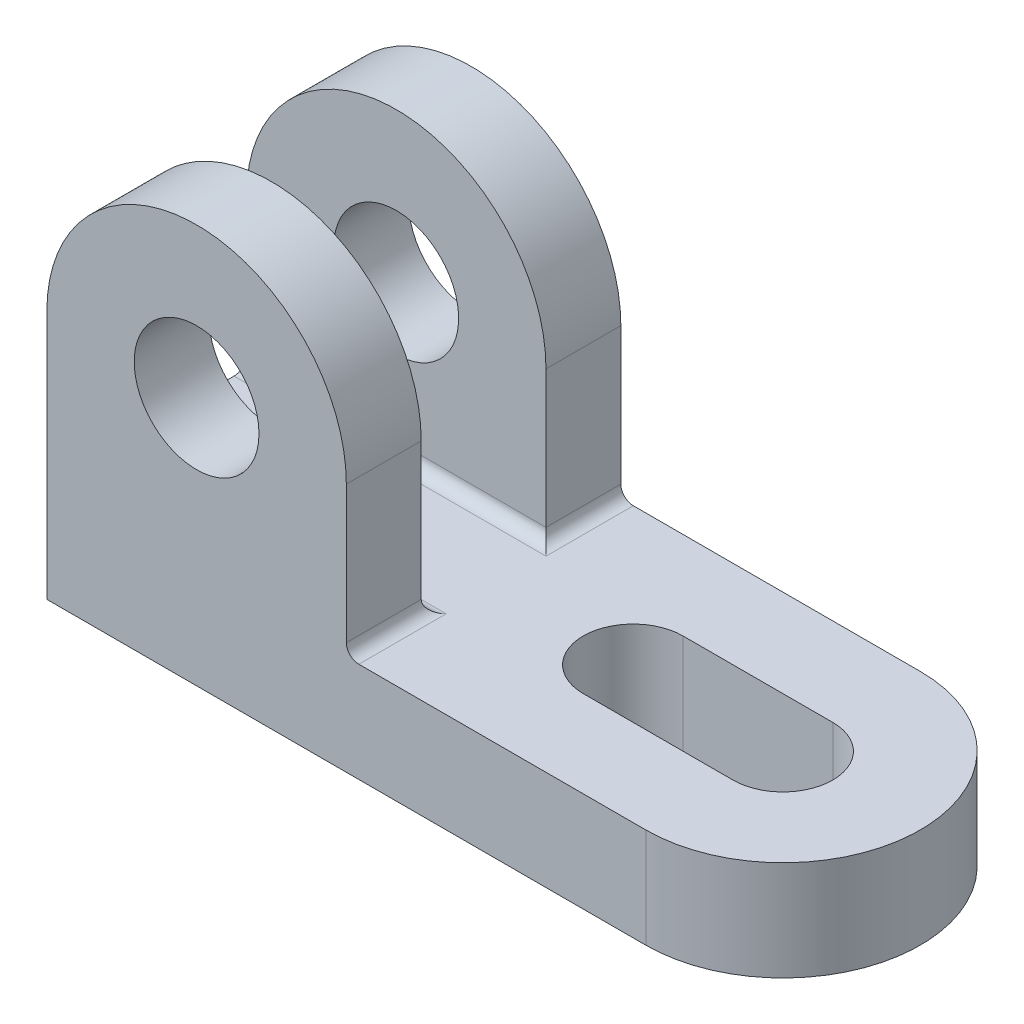
ISO-10303-21;
HEADER;
FILE_DESCRIPTION(('STEP AP214'),'2;1');
FILE_NAME('part.step','',(''),(''),'','','');
FILE_SCHEMA(('AUTOMOTIVE_DESIGN { 1 0 10303 214 1 1 1 1 }'));
ENDSEC;
DATA;
#1=APPLICATION_CONTEXT('core data for automotive mechanical design processes');
#2=APPLICATION_PROTOCOL_DEFINITION('international standard','automotive_design',2000,#1);
#3=PRODUCT_CONTEXT('',#1,'mechanical');
#4=PRODUCT('Part','Part','',(#3));
#5=PRODUCT_RELATED_PRODUCT_CATEGORY('part','',(#4));
#6=PRODUCT_DEFINITION_FORMATION('','',#4);
#7=PRODUCT_DEFINITION_CONTEXT('part definition',#1,'design');
#8=PRODUCT_DEFINITION('design','',#6,#7);
#9=PRODUCT_DEFINITION_SHAPE('','',#8);
#10=(LENGTH_UNIT() NAMED_UNIT(*) SI_UNIT(.MILLI.,.METRE.));
#11=(NAMED_UNIT(*) PLANE_ANGLE_UNIT() SI_UNIT($,.RADIAN.));
#12=(NAMED_UNIT(*) SI_UNIT($,.STERADIAN.) SOLID_ANGLE_UNIT());
#13=UNCERTAINTY_MEASURE_WITH_UNIT(LENGTH_MEASURE(1.E-05),#10,'distance_accuracy_value','');
#14=(GEOMETRIC_REPRESENTATION_CONTEXT(3) GLOBAL_UNCERTAINTY_ASSIGNED_CONTEXT((#13)) GLOBAL_UNIT_ASSIGNED_CONTEXT((#10,
#11,#12)) REPRESENTATION_CONTEXT('',''));
#15=CARTESIAN_POINT('',(0.,0.,0.));
#16=DIRECTION('',(0.,0.,1.));
#17=DIRECTION('',(1.,0.,0.));
#18=AXIS2_PLACEMENT_3D('',#15,#16,#17);
#19=CARTESIAN_POINT('',(0.,16.,0.));
#20=DIRECTION('',(1.,0.,0.));
#21=DIRECTION('',(0.,0.,-1.));
#22=AXIS2_PLACEMENT_3D('',#19,#20,#21);
#23=PLANE('',#22);
#24=DIRECTION('',(0.,0.,1.));
#25=VECTOR('',#24,1.);
#26=CARTESIAN_POINT('',(0.,0.,0.));
#27=LINE('',#26,#25);
#28=CARTESIAN_POINT('',(0.,0.,-44.));
#29=VERTEX_POINT('',#28);
#30=CARTESIAN_POINT('',(0.,0.,0.));
#31=VERTEX_POINT('',#30);
#32=EDGE_CURVE('E252',#29,#31,#27,.T.);
#33=ORIENTED_EDGE('',*,*,#32,.T.);
#34=DIRECTION('',(0.,-1.,0.));
#35=VECTOR('',#34,1.);
#36=CARTESIAN_POINT('',(0.,16.,0.));
#37=LINE('',#36,#35);
#38=CARTESIAN_POINT('',(0.,40.,0.));
#39=VERTEX_POINT('',#38);
#40=EDGE_CURVE('E279',#39,#31,#37,.T.);
#41=ORIENTED_EDGE('',*,*,#40,.F.);
#42=DIRECTION('',(0.,0.,1.));
#43=VECTOR('',#42,1.);
#44=CARTESIAN_POINT('',(0.,40.,-12.));
#45=LINE('',#44,#43);
#46=CARTESIAN_POINT('',(0.,40.,-12.));
#47=VERTEX_POINT('',#46);
#48=EDGE_CURVE('E211',#47,#39,#45,.T.);
#49=ORIENTED_EDGE('',*,*,#48,.F.);
#50=DIRECTION('',(0.,1.,0.));
#51=VECTOR('',#50,1.);
#52=CARTESIAN_POINT('',(0.,0.,-12.));
#53=LINE('',#52,#51);
#54=CARTESIAN_POINT('',(0.,18.,-12.));
#55=VERTEX_POINT('',#54);
#56=EDGE_CURVE('E210',#55,#47,#53,.T.);
#57=ORIENTED_EDGE('',*,*,#56,.F.);
#58=CARTESIAN_POINT('',(0.,18.,-14.));
#59=DIRECTION('',(1.,0.,0.));
#60=DIRECTION('',(0.,0.,-1.));
#61=AXIS2_PLACEMENT_3D('',#58,#59,#60);
#62=CIRCLE('',#61,2.);
#63=CARTESIAN_POINT('',(0.,16.,-14.));
#64=VERTEX_POINT('',#63);
#65=EDGE_CURVE('E11',#55,#64,#62,.T.);
#66=ORIENTED_EDGE('',*,*,#65,.T.);
#67=DIRECTION('',(0.,0.,1.));
#68=VECTOR('',#67,1.);
#69=CARTESIAN_POINT('',(0.,16.,0.));
#70=LINE('',#69,#68);
#71=CARTESIAN_POINT('',(0.,16.,-30.));
#72=VERTEX_POINT('',#71);
#73=EDGE_CURVE('E251',#72,#64,#70,.T.);
#74=ORIENTED_EDGE('',*,*,#73,.F.);
#75=CARTESIAN_POINT('',(0.,18.,-30.));
#76=DIRECTION('',(1.,0.,0.));
#77=DIRECTION('',(0.,0.,-1.));
#78=AXIS2_PLACEMENT_3D('',#75,#76,#77);
#79=CIRCLE('',#78,2.);
#80=CARTESIAN_POINT('',(0.,18.,-32.));
#81=VERTEX_POINT('',#80);
#82=EDGE_CURVE('E172',#72,#81,#79,.T.);
#83=ORIENTED_EDGE('',*,*,#82,.T.);
#84=DIRECTION('',(0.,1.,0.));
#85=VECTOR('',#84,1.);
#86=CARTESIAN_POINT('',(0.,16.,-32.));
#87=LINE('',#86,#85);
#88=CARTESIAN_POINT('',(0.,40.,-32.));
#89=VERTEX_POINT('',#88);
#90=EDGE_CURVE('E163',#81,#89,#87,.T.);
#91=ORIENTED_EDGE('',*,*,#90,.T.);
#92=DIRECTION('',(0.,0.,-1.));
#93=VECTOR('',#92,1.);
#94=CARTESIAN_POINT('',(0.,40.,-32.));
#95=LINE('',#94,#93);
#96=CARTESIAN_POINT('',(0.,40.,-44.));
#97=VERTEX_POINT('',#96);
#98=EDGE_CURVE('E169',#89,#97,#95,.T.);
#99=ORIENTED_EDGE('',*,*,#98,.T.);
#100=DIRECTION('',(0.,-1.,0.));
#101=VECTOR('',#100,1.);
#102=CARTESIAN_POINT('',(0.,16.,-44.));
#103=LINE('',#102,#101);
#104=EDGE_CURVE('E262',#97,#29,#103,.T.);
#105=ORIENTED_EDGE('',*,*,#104,.T.);
#106=EDGE_LOOP('',(#33,#41,#49,#57,#66,#74,#83,#91,#99,#105));
#107=FACE_BOUND('',#106,.T.);
#108=ADVANCED_FACE('F43',(#107),#23,.F.);
#109=CARTESIAN_POINT('',(0.,16.,0.));
#110=DIRECTION('',(0.,0.,-1.));
#111=DIRECTION('',(-1.,0.,0.));
#112=AXIS2_PLACEMENT_3D('',#109,#110,#111);
#113=PLANE('',#112);
#114=DIRECTION('',(1.,0.,0.));
#115=VECTOR('',#114,1.);
#116=CARTESIAN_POINT('',(0.,0.,0.));
#117=LINE('',#116,#115);
#118=CARTESIAN_POINT('',(96.,0.,0.));
#119=VERTEX_POINT('',#118);
#120=EDGE_CURVE('E266',#31,#119,#117,.T.);
#121=ORIENTED_EDGE('',*,*,#120,.T.);
#122=DIRECTION('',(0.,-1.,0.));
#123=VECTOR('',#122,1.);
#124=CARTESIAN_POINT('',(96.,16.,0.));
#125=LINE('',#124,#123);
#126=CARTESIAN_POINT('',(96.,16.,0.));
#127=VERTEX_POINT('',#126);
#128=EDGE_CURVE('E274',#127,#119,#125,.T.);
#129=ORIENTED_EDGE('',*,*,#128,.F.);
#130=DIRECTION('',(1.,0.,0.));
#131=VECTOR('',#130,1.);
#132=CARTESIAN_POINT('',(0.,16.,0.));
#133=LINE('',#132,#131);
#134=CARTESIAN_POINT('',(50.,16.,0.));
#135=VERTEX_POINT('',#134);
#136=EDGE_CURVE('E258',#135,#127,#133,.T.);
#137=ORIENTED_EDGE('',*,*,#136,.F.);
#138=CARTESIAN_POINT('',(50.,18.,0.));
#139=DIRECTION('',(0.,0.,-1.));
#140=DIRECTION('',(-1.,0.,0.));
#141=AXIS2_PLACEMENT_3D('',#138,#139,#140);
#142=CIRCLE('',#141,2.);
#143=CARTESIAN_POINT('',(48.,18.,0.));
#144=VERTEX_POINT('',#143);
#145=EDGE_CURVE('E55',#135,#144,#142,.T.);
#146=ORIENTED_EDGE('',*,*,#145,.T.);
#147=DIRECTION('',(0.,1.,0.));
#148=VECTOR('',#147,1.);
#149=CARTESIAN_POINT('',(48.,0.,0.));
#150=LINE('',#149,#148);
#151=CARTESIAN_POINT('',(48.,40.,0.));
#152=VERTEX_POINT('',#151);
#153=EDGE_CURVE('E204',#144,#152,#150,.T.);
#154=ORIENTED_EDGE('',*,*,#153,.T.);
#155=CARTESIAN_POINT('',(24.,40.,0.));
#156=DIRECTION('',(0.,0.,1.));
#157=DIRECTION('',(1.,0.,0.));
#158=AXIS2_PLACEMENT_3D('',#155,#156,#157);
#159=CIRCLE('',#158,24.);
#160=EDGE_CURVE('E212',#152,#39,#159,.T.);
#161=ORIENTED_EDGE('',*,*,#160,.T.);
#162=ORIENTED_EDGE('',*,*,#40,.T.);
#163=EDGE_LOOP('',(#121,#129,#137,#146,#154,#161,#162));
#164=FACE_BOUND('',#163,.T.);
#165=CARTESIAN_POINT('',(24.,40.,0.));
#166=DIRECTION('',(0.,0.,1.));
#167=DIRECTION('',(1.,0.,0.));
#168=AXIS2_PLACEMENT_3D('',#165,#166,#167);
#169=CIRCLE('',#168,10.);
#170=CARTESIAN_POINT('',(34.,40.,0.));
#171=VERTEX_POINT('',#170);
#172=EDGE_CURVE('E196',#171,#171,#169,.T.);
#173=ORIENTED_EDGE('',*,*,#172,.F.);
#174=EDGE_LOOP('',(#173));
#175=FACE_BOUND('',#174,.T.);
#176=ADVANCED_FACE('F336',(#164,#175),#113,.F.);
#177=CARTESIAN_POINT('',(96.,16.,-22.));
#178=DIRECTION('',(0.,-1.,0.));
#179=DIRECTION('',(0.,0.,-1.));
#180=AXIS2_PLACEMENT_3D('',#177,#178,#179);
#181=CYLINDRICAL_SURFACE('',#180,22.);
#182=CARTESIAN_POINT('',(96.,0.,-22.));
#183=DIRECTION('',(0.,1.,0.));
#184=DIRECTION('',(0.,0.,1.));
#185=AXIS2_PLACEMENT_3D('',#182,#183,#184);
#186=CIRCLE('',#185,22.);
#187=CARTESIAN_POINT('',(96.,0.,-44.));
#188=VERTEX_POINT('',#187);
#189=EDGE_CURVE('E268',#119,#188,#186,.T.);
#190=ORIENTED_EDGE('',*,*,#189,.T.);
#191=DIRECTION('',(0.,-1.,0.));
#192=VECTOR('',#191,1.);
#193=CARTESIAN_POINT('',(96.,16.,-44.));
#194=LINE('',#193,#192);
#195=CARTESIAN_POINT('',(96.,16.,-44.));
#196=VERTEX_POINT('',#195);
#197=EDGE_CURVE('E275',#196,#188,#194,.T.);
#198=ORIENTED_EDGE('',*,*,#197,.F.);
#199=CARTESIAN_POINT('',(96.,16.,-22.));
#200=DIRECTION('',(0.,1.,0.));
#201=DIRECTION('',(0.,0.,1.));
#202=AXIS2_PLACEMENT_3D('',#199,#200,#201);
#203=CIRCLE('',#202,22.);
#204=EDGE_CURVE('E259',#127,#196,#203,.T.);
#205=ORIENTED_EDGE('',*,*,#204,.F.);
#206=ORIENTED_EDGE('',*,*,#128,.T.);
#207=EDGE_LOOP('',(#190,#198,#205,#206));
#208=FACE_BOUND('',#207,.T.);
#209=ADVANCED_FACE('F349',(#208),#181,.T.);
#210=CARTESIAN_POINT('',(0.,16.,-44.));
#211=DIRECTION('',(0.,0.,1.));
#212=DIRECTION('',(1.,0.,0.));
#213=AXIS2_PLACEMENT_3D('',#210,#211,#212);
#214=PLANE('',#213);
#215=DIRECTION('',(-1.,0.,0.));
#216=VECTOR('',#215,1.);
#217=CARTESIAN_POINT('',(0.,0.,-44.));
#218=LINE('',#217,#216);
#219=EDGE_CURVE('E260',#188,#29,#218,.T.);
#220=ORIENTED_EDGE('',*,*,#219,.T.);
#221=ORIENTED_EDGE('',*,*,#104,.F.);
#222=CARTESIAN_POINT('',(24.,40.,-44.));
#223=DIRECTION('',(0.,0.,-1.));
#224=DIRECTION('',(-1.,0.,0.));
#225=AXIS2_PLACEMENT_3D('',#222,#223,#224);
#226=CIRCLE('',#225,24.);
#227=CARTESIAN_POINT('',(48.,40.,-44.));
#228=VERTEX_POINT('',#227);
#229=EDGE_CURVE('E181',#97,#228,#226,.T.);
#230=ORIENTED_EDGE('',*,*,#229,.T.);
#231=DIRECTION('',(0.,-1.,0.));
#232=VECTOR('',#231,1.);
#233=CARTESIAN_POINT('',(48.,16.,-44.));
#234=LINE('',#233,#232);
#235=CARTESIAN_POINT('',(48.,18.,-44.));
#236=VERTEX_POINT('',#235);
#237=EDGE_CURVE('E176',#228,#236,#234,.T.);
#238=ORIENTED_EDGE('',*,*,#237,.T.);
#239=CARTESIAN_POINT('',(50.,18.,-44.));
#240=DIRECTION('',(0.,0.,1.));
#241=DIRECTION('',(1.,0.,0.));
#242=AXIS2_PLACEMENT_3D('',#239,#240,#241);
#243=CIRCLE('',#242,2.);
#244=CARTESIAN_POINT('',(50.,16.,-44.));
#245=VERTEX_POINT('',#244);
#246=EDGE_CURVE('E297',#236,#245,#243,.T.);
#247=ORIENTED_EDGE('',*,*,#246,.T.);
#248=DIRECTION('',(-1.,0.,0.));
#249=VECTOR('',#248,1.);
#250=CARTESIAN_POINT('',(0.,16.,-44.));
#251=LINE('',#250,#249);
#252=EDGE_CURVE('E261',#196,#245,#251,.T.);
#253=ORIENTED_EDGE('',*,*,#252,.F.);
#254=ORIENTED_EDGE('',*,*,#197,.T.);
#255=EDGE_LOOP('',(#220,#221,#230,#238,#247,#253,#254));
#256=FACE_BOUND('',#255,.T.);
#257=CARTESIAN_POINT('',(24.,40.,-44.));
#258=DIRECTION('',(0.,0.,-1.));
#259=DIRECTION('',(-1.,0.,0.));
#260=AXIS2_PLACEMENT_3D('',#257,#258,#259);
#261=CIRCLE('',#260,10.);
#262=CARTESIAN_POINT('',(14.,40.,-44.));
#263=VERTEX_POINT('',#262);
#264=EDGE_CURVE('E301',#263,#263,#261,.T.);
#265=ORIENTED_EDGE('',*,*,#264,.F.);
#266=EDGE_LOOP('',(#265));
#267=FACE_BOUND('',#266,.T.);
#268=ADVANCED_FACE('F330',(#256,#267),#214,.F.);
#269=CARTESIAN_POINT('',(96.,16.,-22.));
#270=DIRECTION('',(0.,1.,0.));
#271=DIRECTION('',(0.,0.,1.));
#272=AXIS2_PLACEMENT_3D('',#269,#270,#271);
#273=PLANE('',#272);
#274=ORIENTED_EDGE('',*,*,#252,.T.);
#275=DIRECTION('',(0.,0.,-1.));
#276=VECTOR('',#275,1.);
#277=CARTESIAN_POINT('',(50.,16.,-32.));
#278=LINE('',#277,#276);
#279=CARTESIAN_POINT('',(50.,16.,-30.));
#280=VERTEX_POINT('',#279);
#281=EDGE_CURVE('E292',#245,#280,#278,.F.);
#282=ORIENTED_EDGE('',*,*,#281,.T.);
#283=DIRECTION('',(-1.,0.,0.));
#284=VECTOR('',#283,1.);
#285=CARTESIAN_POINT('',(96.,16.,-30.));
#286=LINE('',#285,#284);
#287=EDGE_CURVE('E288',#280,#72,#286,.T.);
#288=ORIENTED_EDGE('',*,*,#287,.T.);
#289=ORIENTED_EDGE('',*,*,#73,.T.);
#290=DIRECTION('',(-1.,0.,0.));
#291=VECTOR('',#290,1.);
#292=CARTESIAN_POINT('',(96.,16.,-14.));
#293=LINE('',#292,#291);
#294=CARTESIAN_POINT('',(50.,16.,-14.));
#295=VERTEX_POINT('',#294);
#296=EDGE_CURVE('E283',#64,#295,#293,.F.);
#297=ORIENTED_EDGE('',*,*,#296,.T.);
#298=DIRECTION('',(0.,0.,1.));
#299=VECTOR('',#298,1.);
#300=CARTESIAN_POINT('',(50.,16.,0.));
#301=LINE('',#300,#299);
#302=EDGE_CURVE('E289',#295,#135,#301,.T.);
#303=ORIENTED_EDGE('',*,*,#302,.T.);
#304=ORIENTED_EDGE('',*,*,#136,.T.);
#305=ORIENTED_EDGE('',*,*,#204,.T.);
#306=EDGE_LOOP('',(#274,#282,#288,#289,#297,#303,#304,#305));
#307=FACE_BOUND('',#306,.T.);
#308=CARTESIAN_POINT('',(96.0557415435694,16.,-21.9095880470179));
#309=DIRECTION('',(0.,1.,0.));
#310=DIRECTION('',(0.,0.,1.));
#311=AXIS2_PLACEMENT_3D('',#308,#309,#310);
#312=CIRCLE('',#311,8.);
#313=CARTESIAN_POINT('',(96.0557415435694,16.,-13.9095880470179));
#314=VERTEX_POINT('',#313);
#315=CARTESIAN_POINT('',(96.0557415435694,16.,-29.9095880470179));
#316=VERTEX_POINT('',#315);
#317=EDGE_CURVE('E222',#314,#316,#312,.T.);
#318=ORIENTED_EDGE('',*,*,#317,.F.);
#319=DIRECTION('',(1.,0.,0.));
#320=VECTOR('',#319,1.);
#321=CARTESIAN_POINT('',(72.0557415435694,16.,-13.9095880470179));
#322=LINE('',#321,#320);
#323=CARTESIAN_POINT('',(72.0557415435694,16.,-13.9095880470179));
#324=VERTEX_POINT('',#323);
#325=EDGE_CURVE('E238',#324,#314,#322,.T.);
#326=ORIENTED_EDGE('',*,*,#325,.F.);
#327=CARTESIAN_POINT('',(72.0557415435694,16.,-21.9095880470179));
#328=DIRECTION('',(0.,1.,0.));
#329=DIRECTION('',(0.,0.,1.));
#330=AXIS2_PLACEMENT_3D('',#327,#328,#329);
#331=CIRCLE('',#330,8.);
#332=CARTESIAN_POINT('',(72.0557415435694,16.,-29.9095880470179));
#333=VERTEX_POINT('',#332);
#334=EDGE_CURVE('E240',#333,#324,#331,.T.);
#335=ORIENTED_EDGE('',*,*,#334,.F.);
#336=DIRECTION('',(-1.,0.,0.));
#337=VECTOR('',#336,1.);
#338=CARTESIAN_POINT('',(96.0557415435694,16.,-29.9095880470179));
#339=LINE('',#338,#337);
#340=EDGE_CURVE('E233',#316,#333,#339,.T.);
#341=ORIENTED_EDGE('',*,*,#340,.F.);
#342=EDGE_LOOP('',(#318,#326,#335,#341));
#343=FACE_BOUND('',#342,.T.);
#344=ADVANCED_FACE('F318',(#307,#343),#273,.T.);
#345=CARTESIAN_POINT('',(96.,0.,-22.));
#346=DIRECTION('',(0.,1.,0.));
#347=DIRECTION('',(0.,0.,1.));
#348=AXIS2_PLACEMENT_3D('',#345,#346,#347);
#349=PLANE('',#348);
#350=DIRECTION('',(-1.,0.,0.));
#351=VECTOR('',#350,1.);
#352=CARTESIAN_POINT('',(72.0557415435694,0.,-13.9095880470179));
#353=LINE('',#352,#351);
#354=CARTESIAN_POINT('',(96.0557415435694,0.,-13.9095880470179));
#355=VERTEX_POINT('',#354);
#356=CARTESIAN_POINT('',(72.0557415435694,0.,-13.9095880470179));
#357=VERTEX_POINT('',#356);
#358=EDGE_CURVE('E227',#355,#357,#353,.T.);
#359=ORIENTED_EDGE('',*,*,#358,.F.);
#360=CARTESIAN_POINT('',(96.0557415435694,0.,-21.9095880470179));
#361=DIRECTION('',(0.,1.,0.));
#362=DIRECTION('',(0.,0.,1.));
#363=AXIS2_PLACEMENT_3D('',#360,#361,#362);
#364=CIRCLE('',#363,8.);
#365=CARTESIAN_POINT('',(96.0557415435694,0.,-29.9095880470179));
#366=VERTEX_POINT('',#365);
#367=EDGE_CURVE('E230',#366,#355,#364,.F.);
#368=ORIENTED_EDGE('',*,*,#367,.F.);
#369=DIRECTION('',(1.,0.,0.));
#370=VECTOR('',#369,1.);
#371=CARTESIAN_POINT('',(96.0557415435694,0.,-29.9095880470179));
#372=LINE('',#371,#370);
#373=CARTESIAN_POINT('',(72.0557415435694,0.,-29.9095880470179));
#374=VERTEX_POINT('',#373);
#375=EDGE_CURVE('E231',#374,#366,#372,.T.);
#376=ORIENTED_EDGE('',*,*,#375,.F.);
#377=CARTESIAN_POINT('',(72.0557415435694,0.,-21.9095880470179));
#378=DIRECTION('',(0.,1.,0.));
#379=DIRECTION('',(0.,0.,1.));
#380=AXIS2_PLACEMENT_3D('',#377,#378,#379);
#381=CIRCLE('',#380,8.);
#382=EDGE_CURVE('E221',#357,#374,#381,.F.);
#383=ORIENTED_EDGE('',*,*,#382,.F.);
#384=EDGE_LOOP('',(#359,#368,#376,#383));
#385=FACE_BOUND('',#384,.T.);
#386=ORIENTED_EDGE('',*,*,#32,.F.);
#387=ORIENTED_EDGE('',*,*,#219,.F.);
#388=ORIENTED_EDGE('',*,*,#189,.F.);
#389=ORIENTED_EDGE('',*,*,#120,.F.);
#390=EDGE_LOOP('',(#386,#387,#388,#389));
#391=FACE_BOUND('',#390,.T.);
#392=ADVANCED_FACE('F335',(#385,#391),#349,.F.);
#393=CARTESIAN_POINT('',(96.0557415435694,-43.081318457076,-21.9095880470179));
#394=DIRECTION('',(0.,1.,0.));
#395=DIRECTION('',(0.,0.,1.));
#396=AXIS2_PLACEMENT_3D('',#393,#394,#395);
#397=CYLINDRICAL_SURFACE('',#396,8.);
#398=ORIENTED_EDGE('',*,*,#367,.T.);
#399=DIRECTION('',(0.,1.,0.));
#400=VECTOR('',#399,1.);
#401=CARTESIAN_POINT('',(96.0557415435694,-43.081318457076,-13.9095880470179));
#402=LINE('',#401,#400);
#403=EDGE_CURVE('E229',#355,#314,#402,.T.);
#404=ORIENTED_EDGE('',*,*,#403,.T.);
#405=ORIENTED_EDGE('',*,*,#317,.T.);
#406=DIRECTION('',(0.,1.,0.));
#407=VECTOR('',#406,1.);
#408=CARTESIAN_POINT('',(96.0557415435694,-43.081318457076,-29.9095880470179));
#409=LINE('',#408,#407);
#410=EDGE_CURVE('E244',#366,#316,#409,.T.);
#411=ORIENTED_EDGE('',*,*,#410,.F.);
#412=EDGE_LOOP('',(#398,#404,#405,#411));
#413=FACE_BOUND('',#412,.T.);
#414=ADVANCED_FACE('F372',(#413),#397,.F.);
#415=CARTESIAN_POINT('',(72.0557415435694,-43.081318457076,-13.9095880470179));
#416=DIRECTION('',(0.,0.,1.));
#417=DIRECTION('',(1.,0.,0.));
#418=AXIS2_PLACEMENT_3D('',#415,#416,#417);
#419=PLANE('',#418);
#420=ORIENTED_EDGE('',*,*,#358,.T.);
#421=DIRECTION('',(0.,1.,0.));
#422=VECTOR('',#421,1.);
#423=CARTESIAN_POINT('',(72.0557415435694,-43.081318457076,-13.9095880470179));
#424=LINE('',#423,#422);
#425=EDGE_CURVE('E245',#357,#324,#424,.T.);
#426=ORIENTED_EDGE('',*,*,#425,.T.);
#427=ORIENTED_EDGE('',*,*,#325,.T.);
#428=ORIENTED_EDGE('',*,*,#403,.F.);
#429=EDGE_LOOP('',(#420,#426,#427,#428));
#430=FACE_BOUND('',#429,.T.);
#431=ADVANCED_FACE('F379',(#430),#419,.F.);
#432=CARTESIAN_POINT('',(72.0557415435694,-43.081318457076,-21.9095880470179));
#433=DIRECTION('',(0.,1.,0.));
#434=DIRECTION('',(0.,0.,1.));
#435=AXIS2_PLACEMENT_3D('',#432,#433,#434);
#436=CYLINDRICAL_SURFACE('',#435,8.);
#437=ORIENTED_EDGE('',*,*,#382,.T.);
#438=DIRECTION('',(0.,1.,0.));
#439=VECTOR('',#438,1.);
#440=CARTESIAN_POINT('',(72.0557415435694,-43.081318457076,-29.9095880470179));
#441=LINE('',#440,#439);
#442=EDGE_CURVE('E246',#374,#333,#441,.T.);
#443=ORIENTED_EDGE('',*,*,#442,.T.);
#444=ORIENTED_EDGE('',*,*,#334,.T.);
#445=ORIENTED_EDGE('',*,*,#425,.F.);
#446=EDGE_LOOP('',(#437,#443,#444,#445));
#447=FACE_BOUND('',#446,.T.);
#448=ADVANCED_FACE('F384',(#447),#436,.F.);
#449=CARTESIAN_POINT('',(96.0557415435694,-43.081318457076,-29.9095880470179));
#450=DIRECTION('',(0.,0.,-1.));
#451=DIRECTION('',(-1.,0.,0.));
#452=AXIS2_PLACEMENT_3D('',#449,#450,#451);
#453=PLANE('',#452);
#454=ORIENTED_EDGE('',*,*,#375,.T.);
#455=ORIENTED_EDGE('',*,*,#410,.T.);
#456=ORIENTED_EDGE('',*,*,#340,.T.);
#457=ORIENTED_EDGE('',*,*,#442,.F.);
#458=EDGE_LOOP('',(#454,#455,#456,#457));
#459=FACE_BOUND('',#458,.T.);
#460=ADVANCED_FACE('F385',(#459),#453,.F.);
#461=CARTESIAN_POINT('',(24.,40.,-12.));
#462=DIRECTION('',(0.,0.,1.));
#463=DIRECTION('',(1.,0.,0.));
#464=AXIS2_PLACEMENT_3D('',#461,#462,#463);
#465=CYLINDRICAL_SURFACE('',#464,24.);
#466=ORIENTED_EDGE('',*,*,#160,.F.);
#467=DIRECTION('',(0.,0.,1.));
#468=VECTOR('',#467,1.);
#469=CARTESIAN_POINT('',(48.,40.,-12.));
#470=LINE('',#469,#468);
#471=CARTESIAN_POINT('',(48.,40.,-12.));
#472=VERTEX_POINT('',#471);
#473=EDGE_CURVE('E217',#472,#152,#470,.T.);
#474=ORIENTED_EDGE('',*,*,#473,.F.);
#475=CARTESIAN_POINT('',(24.,40.,-12.));
#476=DIRECTION('',(0.,0.,1.));
#477=DIRECTION('',(1.,0.,0.));
#478=AXIS2_PLACEMENT_3D('',#475,#476,#477);
#479=CIRCLE('',#478,24.);
#480=EDGE_CURVE('E201',#472,#47,#479,.T.);
#481=ORIENTED_EDGE('',*,*,#480,.T.);
#482=ORIENTED_EDGE('',*,*,#48,.T.);
#483=EDGE_LOOP('',(#466,#474,#481,#482));
#484=FACE_BOUND('',#483,.T.);
#485=ADVANCED_FACE('F340',(#484),#465,.T.);
#486=CARTESIAN_POINT('',(48.,0.,-12.));
#487=DIRECTION('',(1.,0.,0.));
#488=DIRECTION('',(0.,1.,0.));
#489=AXIS2_PLACEMENT_3D('',#486,#487,#488);
#490=PLANE('',#489);
#491=ORIENTED_EDGE('',*,*,#153,.F.);
#492=DIRECTION('',(0.,0.,1.));
#493=VECTOR('',#492,1.);
#494=CARTESIAN_POINT('',(48.,18.,-12.));
#495=LINE('',#494,#493);
#496=CARTESIAN_POINT('',(48.,18.,-12.));
#497=VERTEX_POINT('',#496);
#498=EDGE_CURVE('E70',#144,#497,#495,.F.);
#499=ORIENTED_EDGE('',*,*,#498,.T.);
#500=DIRECTION('',(0.,1.,0.));
#501=VECTOR('',#500,1.);
#502=CARTESIAN_POINT('',(48.,0.,-12.));
#503=LINE('',#502,#501);
#504=EDGE_CURVE('E207',#497,#472,#503,.T.);
#505=ORIENTED_EDGE('',*,*,#504,.T.);
#506=ORIENTED_EDGE('',*,*,#473,.T.);
#507=EDGE_LOOP('',(#491,#499,#505,#506));
#508=FACE_BOUND('',#507,.T.);
#509=ADVANCED_FACE('F343',(#508),#490,.T.);
#510=CARTESIAN_POINT('',(24.,40.,-12.));
#511=DIRECTION('',(0.,0.,1.));
#512=DIRECTION('',(1.,0.,0.));
#513=AXIS2_PLACEMENT_3D('',#510,#511,#512);
#514=CYLINDRICAL_SURFACE('',#513,10.);
#515=CARTESIAN_POINT('',(24.,40.,-12.));
#516=DIRECTION('',(0.,0.,1.));
#517=DIRECTION('',(1.,0.,0.));
#518=AXIS2_PLACEMENT_3D('',#515,#516,#517);
#519=CIRCLE('',#518,10.);
#520=CARTESIAN_POINT('',(34.,40.,-12.));
#521=VERTEX_POINT('',#520);
#522=EDGE_CURVE('E199',#521,#521,#519,.T.);
#523=ORIENTED_EDGE('',*,*,#522,.F.);
#524=EDGE_LOOP('',(#523));
#525=FACE_BOUND('',#524,.T.);
#526=ORIENTED_EDGE('',*,*,#172,.T.);
#527=EDGE_LOOP('',(#526));
#528=FACE_BOUND('',#527,.T.);
#529=ADVANCED_FACE('F394',(#525,#528),#514,.F.);
#530=CARTESIAN_POINT('',(0.,0.,-12.));
#531=DIRECTION('',(0.,0.,1.));
#532=DIRECTION('',(1.,0.,0.));
#533=AXIS2_PLACEMENT_3D('',#530,#531,#532);
#534=PLANE('',#533);
#535=ORIENTED_EDGE('',*,*,#522,.T.);
#536=EDGE_LOOP('',(#535));
#537=FACE_BOUND('',#536,.T.);
#538=ORIENTED_EDGE('',*,*,#504,.F.);
#539=DIRECTION('',(-1.,0.,0.));
#540=VECTOR('',#539,1.);
#541=CARTESIAN_POINT('',(0.,18.,-12.));
#542=LINE('',#541,#540);
#543=EDGE_CURVE('E58',#497,#55,#542,.T.);
#544=ORIENTED_EDGE('',*,*,#543,.T.);
#545=ORIENTED_EDGE('',*,*,#56,.T.);
#546=ORIENTED_EDGE('',*,*,#480,.F.);
#547=EDGE_LOOP('',(#538,#544,#545,#546));
#548=FACE_BOUND('',#547,.T.);
#549=ADVANCED_FACE('F345',(#537,#548),#534,.F.);
#550=CARTESIAN_POINT('',(48.,16.,-32.));
#551=DIRECTION('',(1.,0.,0.));
#552=DIRECTION('',(0.,0.,-1.));
#553=AXIS2_PLACEMENT_3D('',#550,#551,#552);
#554=PLANE('',#553);
#555=DIRECTION('',(0.,-1.,0.));
#556=VECTOR('',#555,1.);
#557=CARTESIAN_POINT('',(48.,16.,-32.));
#558=LINE('',#557,#556);
#559=CARTESIAN_POINT('',(48.,40.,-32.));
#560=VERTEX_POINT('',#559);
#561=CARTESIAN_POINT('',(48.,18.,-32.));
#562=VERTEX_POINT('',#561);
#563=EDGE_CURVE('E183',#560,#562,#558,.T.);
#564=ORIENTED_EDGE('',*,*,#563,.T.);
#565=DIRECTION('',(0.,0.,-1.));
#566=VECTOR('',#565,1.);
#567=CARTESIAN_POINT('',(48.,18.,-44.));
#568=LINE('',#567,#566);
#569=EDGE_CURVE('E281',#562,#236,#568,.T.);
#570=ORIENTED_EDGE('',*,*,#569,.T.);
#571=ORIENTED_EDGE('',*,*,#237,.F.);
#572=DIRECTION('',(0.,0.,-1.));
#573=VECTOR('',#572,1.);
#574=CARTESIAN_POINT('',(48.,40.,-32.));
#575=LINE('',#574,#573);
#576=EDGE_CURVE('E184',#560,#228,#575,.T.);
#577=ORIENTED_EDGE('',*,*,#576,.F.);
#578=EDGE_LOOP('',(#564,#570,#571,#577));
#579=FACE_BOUND('',#578,.T.);
#580=ADVANCED_FACE('F322',(#579),#554,.T.);
#581=CARTESIAN_POINT('',(24.,40.,-32.));
#582=DIRECTION('',(0.,0.,-1.));
#583=DIRECTION('',(-1.,0.,0.));
#584=AXIS2_PLACEMENT_3D('',#581,#582,#583);
#585=CYLINDRICAL_SURFACE('',#584,24.);
#586=ORIENTED_EDGE('',*,*,#229,.F.);
#587=ORIENTED_EDGE('',*,*,#98,.F.);
#588=CARTESIAN_POINT('',(24.,40.,-32.));
#589=DIRECTION('',(0.,0.,-1.));
#590=DIRECTION('',(-1.,0.,0.));
#591=AXIS2_PLACEMENT_3D('',#588,#589,#590);
#592=CIRCLE('',#591,24.);
#593=EDGE_CURVE('E179',#89,#560,#592,.T.);
#594=ORIENTED_EDGE('',*,*,#593,.T.);
#595=ORIENTED_EDGE('',*,*,#576,.T.);
#596=EDGE_LOOP('',(#586,#587,#594,#595));
#597=FACE_BOUND('',#596,.T.);
#598=ADVANCED_FACE('F182',(#597),#585,.T.);
#599=CARTESIAN_POINT('',(24.,40.,-32.));
#600=DIRECTION('',(0.,0.,-1.));
#601=DIRECTION('',(-1.,0.,0.));
#602=AXIS2_PLACEMENT_3D('',#599,#600,#601);
#603=PLANE('',#602);
#604=CARTESIAN_POINT('',(24.,40.,-32.));
#605=DIRECTION('',(0.,0.,-1.));
#606=DIRECTION('',(-1.,0.,0.));
#607=AXIS2_PLACEMENT_3D('',#604,#605,#606);
#608=CIRCLE('',#607,10.);
#609=CARTESIAN_POINT('',(14.,40.,-32.));
#610=VERTEX_POINT('',#609);
#611=EDGE_CURVE('E192',#610,#610,#608,.T.);
#612=ORIENTED_EDGE('',*,*,#611,.T.);
#613=EDGE_LOOP('',(#612));
#614=FACE_BOUND('',#613,.T.);
#615=ORIENTED_EDGE('',*,*,#90,.F.);
#616=DIRECTION('',(-1.,0.,0.));
#617=VECTOR('',#616,1.);
#618=CARTESIAN_POINT('',(24.,18.,-32.));
#619=LINE('',#618,#617);
#620=EDGE_CURVE('E291',#81,#562,#619,.F.);
#621=ORIENTED_EDGE('',*,*,#620,.T.);
#622=ORIENTED_EDGE('',*,*,#563,.F.);
#623=ORIENTED_EDGE('',*,*,#593,.F.);
#624=EDGE_LOOP('',(#615,#621,#622,#623));
#625=FACE_BOUND('',#624,.T.);
#626=ADVANCED_FACE('F189',(#614,#625),#603,.F.);
#627=CARTESIAN_POINT('',(24.,40.,-32.));
#628=DIRECTION('',(0.,0.,-1.));
#629=DIRECTION('',(-1.,0.,0.));
#630=AXIS2_PLACEMENT_3D('',#627,#628,#629);
#631=CYLINDRICAL_SURFACE('',#630,10.);
#632=ORIENTED_EDGE('',*,*,#611,.F.);
#633=EDGE_LOOP('',(#632));
#634=FACE_BOUND('',#633,.T.);
#635=ORIENTED_EDGE('',*,*,#264,.T.);
#636=EDGE_LOOP('',(#635));
#637=FACE_BOUND('',#636,.T.);
#638=ADVANCED_FACE('F360',(#634,#637),#631,.F.);
#639=CARTESIAN_POINT('',(96.,18.,-30.));
#640=DIRECTION('',(-1.,0.,0.));
#641=DIRECTION('',(0.,0.,1.));
#642=AXIS2_PLACEMENT_3D('',#639,#640,#641);
#643=CYLINDRICAL_SURFACE('',#642,2.);
#644=ORIENTED_EDGE('',*,*,#82,.F.);
#645=ORIENTED_EDGE('',*,*,#287,.F.);
#646=CARTESIAN_POINT('',(50.,18.,-30.));
#647=DIRECTION('',(-0.707106781186547,0.,0.707106781186547));
#648=DIRECTION('',(-0.707106781186547,0.,-0.707106781186547));
#649=AXIS2_PLACEMENT_3D('',#646,#647,#648);
#650=ELLIPSE('',#649,2.82842712474619,2.);
#651=EDGE_CURVE('E300',#562,#280,#650,.T.);
#652=ORIENTED_EDGE('',*,*,#651,.F.);
#653=ORIENTED_EDGE('',*,*,#620,.F.);
#654=EDGE_LOOP('',(#644,#645,#652,#653));
#655=FACE_BOUND('',#654,.T.);
#656=ADVANCED_FACE('F325',(#655),#643,.F.);
#657=CARTESIAN_POINT('',(50.,18.,-32.));
#658=DIRECTION('',(0.,0.,1.));
#659=DIRECTION('',(1.,0.,0.));
#660=AXIS2_PLACEMENT_3D('',#657,#658,#659);
#661=CYLINDRICAL_SURFACE('',#660,2.);
#662=ORIENTED_EDGE('',*,*,#651,.T.);
#663=ORIENTED_EDGE('',*,*,#281,.F.);
#664=ORIENTED_EDGE('',*,*,#246,.F.);
#665=ORIENTED_EDGE('',*,*,#569,.F.);
#666=EDGE_LOOP('',(#662,#663,#664,#665));
#667=FACE_BOUND('',#666,.T.);
#668=ADVANCED_FACE('F351',(#667),#661,.F.);
#669=CARTESIAN_POINT('',(0.,18.,-14.));
#670=DIRECTION('',(-1.,0.,0.));
#671=DIRECTION('',(0.,0.,1.));
#672=AXIS2_PLACEMENT_3D('',#669,#670,#671);
#673=CYLINDRICAL_SURFACE('',#672,2.);
#674=ORIENTED_EDGE('',*,*,#65,.F.);
#675=ORIENTED_EDGE('',*,*,#543,.F.);
#676=CARTESIAN_POINT('',(50.,18.,-14.));
#677=DIRECTION('',(-0.707106781186547,0.,-0.707106781186547));
#678=DIRECTION('',(-0.707106781186547,0.,0.707106781186547));
#679=AXIS2_PLACEMENT_3D('',#676,#677,#678);
#680=ELLIPSE('',#679,2.82842712474619,2.);
#681=EDGE_CURVE('E50',#295,#497,#680,.T.);
#682=ORIENTED_EDGE('',*,*,#681,.F.);
#683=ORIENTED_EDGE('',*,*,#296,.F.);
#684=EDGE_LOOP('',(#674,#675,#682,#683));
#685=FACE_BOUND('',#684,.T.);
#686=ADVANCED_FACE('F44',(#685),#673,.F.);
#687=CARTESIAN_POINT('',(50.,18.,-22.));
#688=DIRECTION('',(0.,0.,-1.));
#689=DIRECTION('',(-1.,0.,0.));
#690=AXIS2_PLACEMENT_3D('',#687,#688,#689);
#691=CYLINDRICAL_SURFACE('',#690,2.);
#692=ORIENTED_EDGE('',*,*,#681,.T.);
#693=ORIENTED_EDGE('',*,*,#498,.F.);
#694=ORIENTED_EDGE('',*,*,#145,.F.);
#695=ORIENTED_EDGE('',*,*,#302,.F.);
#696=EDGE_LOOP('',(#692,#693,#694,#695));
#697=FACE_BOUND('',#696,.T.);
#698=ADVANCED_FACE('F315',(#697),#691,.F.);
#699=CLOSED_SHELL('',(#108,#176,#209,#268,#344,#392,#414,#431,#448,#460,#485,#509,#529,#549,
#580,#598,#626,#638,#656,#668,#686,#698));
#700=MANIFOLD_SOLID_BREP('B2',#699);
#701=ADVANCED_BREP_SHAPE_REPRESENTATION('',(#18,#700),#14);
#702=SHAPE_DEFINITION_REPRESENTATION(#9,#701);
ENDSEC;
END-ISO-10303-21;
